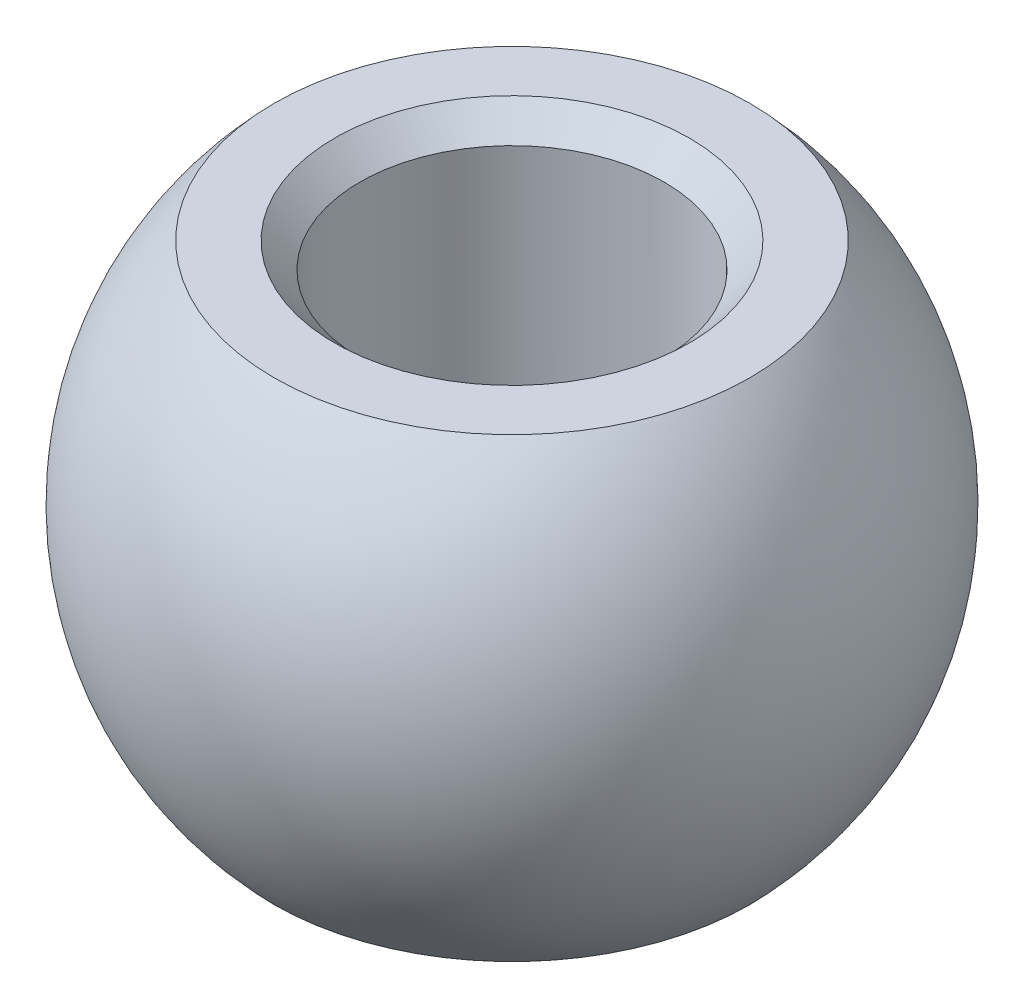
ISO-10303-21;
HEADER;
FILE_DESCRIPTION(('STEP AP214'),'2;1');
FILE_NAME('part.step','',(''),(''),'','','');
FILE_SCHEMA(('AUTOMOTIVE_DESIGN { 1 0 10303 214 1 1 1 1 }'));
ENDSEC;
DATA;
#1=APPLICATION_CONTEXT('core data for automotive mechanical design processes');
#2=APPLICATION_PROTOCOL_DEFINITION('international standard','automotive_design',2000,#1);
#3=PRODUCT_CONTEXT('',#1,'mechanical');
#4=PRODUCT('Part','Part','',(#3));
#5=PRODUCT_RELATED_PRODUCT_CATEGORY('part','',(#4));
#6=PRODUCT_DEFINITION_FORMATION('','',#4);
#7=PRODUCT_DEFINITION_CONTEXT('part definition',#1,'design');
#8=PRODUCT_DEFINITION('design','',#6,#7);
#9=PRODUCT_DEFINITION_SHAPE('','',#8);
#10=(LENGTH_UNIT() NAMED_UNIT(*) SI_UNIT(.MILLI.,.METRE.));
#11=(NAMED_UNIT(*) PLANE_ANGLE_UNIT() SI_UNIT($,.RADIAN.));
#12=(NAMED_UNIT(*) SI_UNIT($,.STERADIAN.) SOLID_ANGLE_UNIT());
#13=UNCERTAINTY_MEASURE_WITH_UNIT(LENGTH_MEASURE(1.E-05),#10,'distance_accuracy_value','');
#14=(GEOMETRIC_REPRESENTATION_CONTEXT(3) GLOBAL_UNCERTAINTY_ASSIGNED_CONTEXT((#13)) GLOBAL_UNIT_ASSIGNED_CONTEXT((#10,
#11,#12)) REPRESENTATION_CONTEXT('',''));
#15=CARTESIAN_POINT('',(0.,0.,0.));
#16=DIRECTION('',(0.,0.,1.));
#17=DIRECTION('',(1.,0.,0.));
#18=AXIS2_PLACEMENT_3D('',#15,#16,#17);
#19=CARTESIAN_POINT('',(0.,0.,0.));
#20=DIRECTION('',(0.,1.,0.));
#21=DIRECTION('',(1.,0.,0.));
#22=AXIS2_PLACEMENT_3D('',#19,#20,#21);
#23=SPHERICAL_SURFACE('',#22,6.5);
#24=CARTESIAN_POINT('',(0.,-4.5,0.));
#25=DIRECTION('',(0.,1.,0.));
#26=DIRECTION('',(0.,0.,1.));
#27=AXIS2_PLACEMENT_3D('',#24,#25,#26);
#28=CIRCLE('',#27,4.69041575982343);
#29=CARTESIAN_POINT('',(4.69041575982343,-4.5,0.));
#30=VERTEX_POINT('',#29);
#31=EDGE_CURVE('E56',#30,#30,#28,.F.);
#32=CARTESIAN_POINT('',(0.,4.5,0.));
#33=DIRECTION('',(0.,-1.,0.));
#34=DIRECTION('',(0.,0.,-1.));
#35=AXIS2_PLACEMENT_3D('',#32,#33,#34);
#36=CIRCLE('',#35,4.69041575982343);
#37=CARTESIAN_POINT('',(4.69041575982343,4.5,0.));
#38=VERTEX_POINT('',#37);
#39=EDGE_CURVE('E55',#38,#38,#36,.F.);
#40=CARTESIAN_POINT('',(4.69041575982343,-4.5,0.));
#41=CARTESIAN_POINT('',(4.76210624204994,-4.42527889124895,0.));
#42=CARTESIAN_POINT('',(4.83200814280828,-4.34884204442719,0.));
#43=CARTESIAN_POINT('',(4.96808186456599,-4.19271728905302,0.));
#44=CARTESIAN_POINT('',(5.03425368556536,-4.11302938050062,0.));
#45=CARTESIAN_POINT('',(5.16271433098249,-3.95058291607591,0.));
#46=CARTESIAN_POINT('',(5.22500315540024,-3.86782436020362,0.));
#47=CARTESIAN_POINT('',(5.34555604093116,-3.69942601736772,0.));
#48=CARTESIAN_POINT('',(5.40382010204432,-3.61378623040411,0.));
#49=CARTESIAN_POINT('',(5.51619027400762,-3.43982088843359,0.));
#50=CARTESIAN_POINT('',(5.57029638485776,-3.35149533342669,0.));
#51=CARTESIAN_POINT('',(5.67422712872889,-3.17236019474046,0.));
#52=CARTESIAN_POINT('',(5.72405176174988,-3.08155061106114,0.));
#53=CARTESIAN_POINT('',(5.81930575610283,-2.89765478890912,0.));
#54=CARTESIAN_POINT('',(5.86473511743478,-2.80456855043642,0.));
#55=CARTESIAN_POINT('',(5.95109482380328,-2.61633200203106,0.));
#56=CARTESIAN_POINT('',(5.99202516883983,-2.5211816920984,0.));
#57=CARTESIAN_POINT('',(6.06929336926804,-2.32903429508149,0.));
#58=CARTESIAN_POINT('',(6.10563122465969,-2.23203720799725,0.));
#59=CARTESIAN_POINT('',(6.17363146116803,-2.03641776920925,0.));
#60=CARTESIAN_POINT('',(6.20529384228472,-1.9377954175055,0.));
#61=CARTESIAN_POINT('',(6.26387082277354,-1.73915067343224,0.));
#62=CARTESIAN_POINT('',(6.29078542214567,-1.63912828106274,0.));
#63=CARTESIAN_POINT('',(6.33980537425188,-1.43791187693933,0.));
#64=CARTESIAN_POINT('',(6.36191072698596,-1.33671786518543,0.));
#65=CARTESIAN_POINT('',(6.40126170378928,-1.13338931918914,0.));
#66=CARTESIAN_POINT('',(6.41850732785851,-1.03125478494676,0.));
#67=CARTESIAN_POINT('',(6.44809946347847,-0.826278438745693,0.));
#68=CARTESIAN_POINT('',(6.4604459750292,-0.723436626787011,0.));
#69=CARTESIAN_POINT('',(6.48021168986709,-0.517280585135567,0.));
#70=CARTESIAN_POINT('',(6.48763089315426,-0.413966355442805,0.));
#71=CARTESIAN_POINT('',(6.49752504822071,-0.207101417166695,0.));
#72=CARTESIAN_POINT('',(6.5,-0.103550708583347,0.));
#73=CARTESIAN_POINT('',(6.5,0.103550708583347,0.));
#74=CARTESIAN_POINT('',(6.49752504822071,0.207101417166695,0.));
#75=CARTESIAN_POINT('',(6.48763089315426,0.413966355442805,0.));
#76=CARTESIAN_POINT('',(6.48021168986709,0.517280585135567,0.));
#77=CARTESIAN_POINT('',(6.4604459750292,0.723436626787011,0.));
#78=CARTESIAN_POINT('',(6.44809946347847,0.826278438745693,0.));
#79=CARTESIAN_POINT('',(6.41850732785851,1.03125478494676,0.));
#80=CARTESIAN_POINT('',(6.40126170378928,1.13338931918914,0.));
#81=CARTESIAN_POINT('',(6.36191072698596,1.33671786518543,0.));
#82=CARTESIAN_POINT('',(6.33980537425188,1.43791187693933,0.));
#83=CARTESIAN_POINT('',(6.29078542214567,1.63912828106274,0.));
#84=CARTESIAN_POINT('',(6.26387082277354,1.73915067343224,0.));
#85=CARTESIAN_POINT('',(6.20529384228472,1.9377954175055,0.));
#86=CARTESIAN_POINT('',(6.17363146116803,2.03641776920925,0.));
#87=CARTESIAN_POINT('',(6.10563122465969,2.23203720799725,0.));
#88=CARTESIAN_POINT('',(6.06929336926804,2.32903429508149,0.));
#89=CARTESIAN_POINT('',(5.99202516883983,2.5211816920984,0.));
#90=CARTESIAN_POINT('',(5.95109482380328,2.61633200203106,0.));
#91=CARTESIAN_POINT('',(5.86473511743478,2.80456855043642,0.));
#92=CARTESIAN_POINT('',(5.81930575610283,2.89765478890912,0.));
#93=CARTESIAN_POINT('',(5.72405176174988,3.08155061106114,0.));
#94=CARTESIAN_POINT('',(5.67422712872889,3.17236019474046,0.));
#95=CARTESIAN_POINT('',(5.57029638485776,3.35149533342669,0.));
#96=CARTESIAN_POINT('',(5.51619027400762,3.43982088843359,0.));
#97=CARTESIAN_POINT('',(5.40382010204432,3.61378623040411,0.));
#98=CARTESIAN_POINT('',(5.34555604093116,3.69942601736772,0.));
#99=CARTESIAN_POINT('',(5.22500315540024,3.86782436020362,0.));
#100=CARTESIAN_POINT('',(5.16271433098249,3.95058291607591,0.));
#101=CARTESIAN_POINT('',(5.03425368556536,4.11302938050061,0.));
#102=CARTESIAN_POINT('',(4.96808186456599,4.19271728905302,0.));
#103=CARTESIAN_POINT('',(4.83200814280828,4.34884204442719,0.));
#104=CARTESIAN_POINT('',(4.76210624204994,4.42527889124895,0.));
#105=CARTESIAN_POINT('',(4.69041575982343,4.5,0.));
#106=B_SPLINE_CURVE_WITH_KNOTS('',3,(#40,#41,#42,#43,#44,#45,#46,#47,#48,#49,#50,#51,#52,#53,
#54,#55,#56,#57,#58,#59,#60,#61,#62,#63,#64,#65,#66,#67,#68,#69,#70,#71,#72,#73,#74,#75,#76,#77,
#78,#79,#80,#81,#82,#83,#84,#85,#86,#87,#88,#89,#90,#91,#92,#93,#94,#95,#96,#97,#98,#99,#100,
#101,#102,#103,#104,#105),.UNSPECIFIED.,.F.,.F.,(4,2,2,2,2,2,2,2,2,2,2,2,2,2,2,2,2,2,2,2,2,2,2,
2,2,2,2,2,2,2,2,2,4),(0.,0.310622570111457,0.621245140222913,0.93186771033437,1.24249028044583,
1.55311285055728,1.86373542066874,2.1743579907802,2.48498056089165,2.79560313100311,
3.10622570111457,3.41684827122602,3.72747084133748,4.03809341144894,4.3487159815604,
4.65933855167185,4.96996112178331,5.28058369189477,5.59120626200622,5.90182883211768,
6.21245140222914,6.52307397234059,6.83369654245205,7.14431911256351,7.45494168267496,
7.76556425278642,8.07618682289788,8.38680939300933,8.69743196312079,9.00805453323225,
9.3186771033437,9.62929967345516,9.93992224356662),.UNSPECIFIED.);
#107=EDGE_CURVE('BSEAM36',#30,#38,#106,.T.);
#108=ORIENTED_EDGE('',*,*,#31,.F.);
#109=ORIENTED_EDGE('',*,*,#39,.F.);
#110=ORIENTED_EDGE('',*,*,#107,.T.);
#111=ORIENTED_EDGE('',*,*,#107,.F.);
#112=EDGE_LOOP('',(#108,#110,#109,#111));
#113=FACE_BOUND('',#112,.T.);
#114=ADVANCED_FACE('F36',(#113),#23,.T.);
#115=CARTESIAN_POINT('',(-7.10684925093635,4.5,-6.5));
#116=DIRECTION('',(0.,-1.,0.));
#117=DIRECTION('',(0.,0.,-1.));
#118=AXIS2_PLACEMENT_3D('',#115,#116,#117);
#119=PLANE('',#118);
#120=CARTESIAN_POINT('',(0.,4.5,0.));
#121=DIRECTION('',(0.,-1.,0.));
#122=DIRECTION('',(0.,0.,-1.));
#123=AXIS2_PLACEMENT_3D('',#120,#121,#122);
#124=CIRCLE('',#123,3.5);
#125=CARTESIAN_POINT('',(0.,4.5,-3.5));
#126=VERTEX_POINT('',#125);
#127=EDGE_CURVE('E10',#126,#126,#124,.T.);
#128=ORIENTED_EDGE('',*,*,#127,.T.);
#129=EDGE_LOOP('',(#128));
#130=FACE_BOUND('',#129,.T.);
#131=ORIENTED_EDGE('',*,*,#39,.T.);
#132=EDGE_LOOP('',(#131));
#133=FACE_BOUND('',#132,.T.);
#134=ADVANCED_FACE('F62',(#130,#133),#119,.F.);
#135=CARTESIAN_POINT('',(-7.10684925093635,-4.5,-6.5));
#136=DIRECTION('',(0.,1.,0.));
#137=DIRECTION('',(0.,0.,1.));
#138=AXIS2_PLACEMENT_3D('',#135,#136,#137);
#139=PLANE('',#138);
#140=CARTESIAN_POINT('',(0.,-4.5,0.));
#141=DIRECTION('',(0.,1.,0.));
#142=DIRECTION('',(0.,0.,1.));
#143=AXIS2_PLACEMENT_3D('',#140,#141,#142);
#144=CIRCLE('',#143,3.5);
#145=CARTESIAN_POINT('',(0.,-4.5,3.5));
#146=VERTEX_POINT('',#145);
#147=EDGE_CURVE('E50',#146,#146,#144,.T.);
#148=ORIENTED_EDGE('',*,*,#147,.T.);
#149=EDGE_LOOP('',(#148));
#150=FACE_BOUND('',#149,.T.);
#151=ORIENTED_EDGE('',*,*,#31,.T.);
#152=EDGE_LOOP('',(#151));
#153=FACE_BOUND('',#152,.T.);
#154=ADVANCED_FACE('F69',(#150,#153),#139,.F.);
#155=CARTESIAN_POINT('',(0.,-4.5,0.));
#156=DIRECTION('',(0.,1.,0.));
#157=DIRECTION('',(0.,0.,1.));
#158=AXIS2_PLACEMENT_3D('',#155,#156,#157);
#159=CYLINDRICAL_SURFACE('',#158,3.);
#160=CARTESIAN_POINT('',(0.,-4.,0.));
#161=DIRECTION('',(0.,1.,0.));
#162=DIRECTION('',(0.,0.,1.));
#163=AXIS2_PLACEMENT_3D('',#160,#161,#162);
#164=CIRCLE('',#163,3.);
#165=CARTESIAN_POINT('',(0.,-4.,3.));
#166=VERTEX_POINT('',#165);
#167=EDGE_CURVE('E42',#166,#166,#164,.F.);
#168=ORIENTED_EDGE('',*,*,#167,.T.);
#169=EDGE_LOOP('',(#168));
#170=FACE_BOUND('',#169,.T.);
#171=CARTESIAN_POINT('',(0.,4.,0.));
#172=DIRECTION('',(0.,-1.,0.));
#173=DIRECTION('',(0.,0.,-1.));
#174=AXIS2_PLACEMENT_3D('',#171,#172,#173);
#175=CIRCLE('',#174,3.);
#176=CARTESIAN_POINT('',(0.,4.,-3.));
#177=VERTEX_POINT('',#176);
#178=EDGE_CURVE('E46',#177,#177,#175,.F.);
#179=ORIENTED_EDGE('',*,*,#178,.T.);
#180=EDGE_LOOP('',(#179));
#181=FACE_BOUND('',#180,.T.);
#182=ADVANCED_FACE('F73',(#170,#181),#159,.F.);
#183=CARTESIAN_POINT('',(0.,-4.5,0.));
#184=DIRECTION('',(0.,-1.,0.));
#185=DIRECTION('',(0.,0.,-1.));
#186=AXIS2_PLACEMENT_3D('',#183,#184,#185);
#187=CONICAL_SURFACE('',#186,3.5,0.785398163397447);
#188=ORIENTED_EDGE('',*,*,#167,.F.);
#189=EDGE_LOOP('',(#188));
#190=FACE_BOUND('',#189,.T.);
#191=ORIENTED_EDGE('',*,*,#147,.F.);
#192=EDGE_LOOP('',(#191));
#193=FACE_BOUND('',#192,.T.);
#194=ADVANCED_FACE('F79',(#190,#193),#187,.F.);
#195=CARTESIAN_POINT('',(0.,4.,0.));
#196=DIRECTION('',(0.,1.,0.));
#197=DIRECTION('',(0.,0.,1.));
#198=AXIS2_PLACEMENT_3D('',#195,#196,#197);
#199=CONICAL_SURFACE('',#198,3.,0.78539816339745);
#200=ORIENTED_EDGE('',*,*,#127,.F.);
#201=EDGE_LOOP('',(#200));
#202=FACE_BOUND('',#201,.T.);
#203=ORIENTED_EDGE('',*,*,#178,.F.);
#204=EDGE_LOOP('',(#203));
#205=FACE_BOUND('',#204,.T.);
#206=ADVANCED_FACE('F84',(#202,#205),#199,.F.);
#207=CLOSED_SHELL('',(#114,#134,#154,#182,#194,#206));
#208=MANIFOLD_SOLID_BREP('B2',#207);
#209=ADVANCED_BREP_SHAPE_REPRESENTATION('',(#18,#208),#14);
#210=SHAPE_DEFINITION_REPRESENTATION(#9,#209);
ENDSEC;
END-ISO-10303-21;
